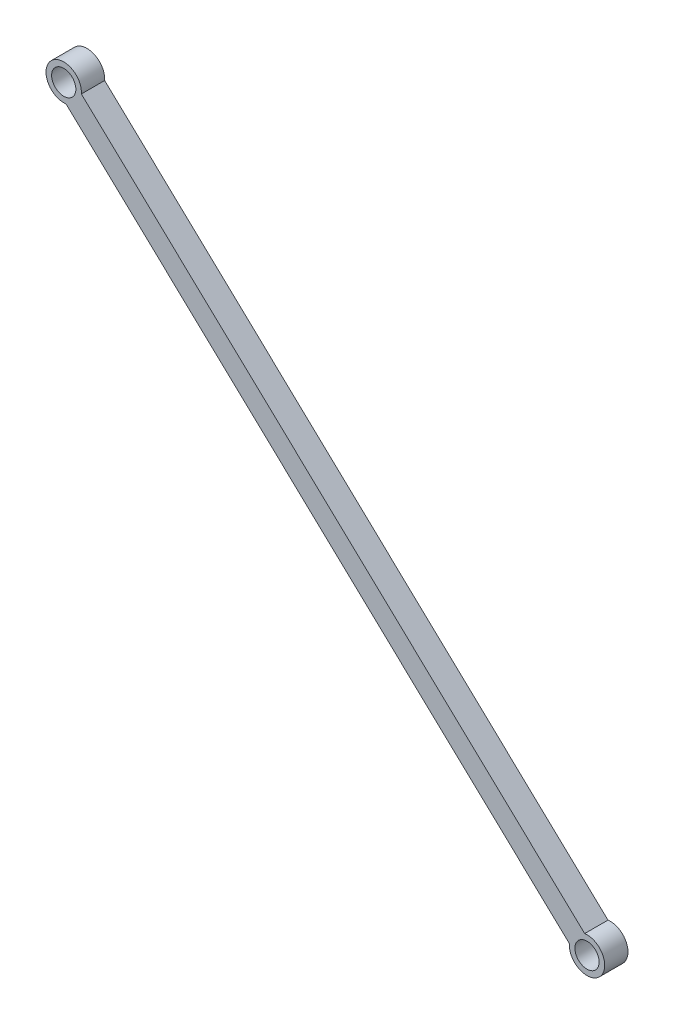
ISO-10303-21;
HEADER;
FILE_DESCRIPTION(('STEP AP214'),'2;1');
FILE_NAME('part.step','',(''),(''),'','','');
FILE_SCHEMA(('AUTOMOTIVE_DESIGN { 1 0 10303 214 1 1 1 1 }'));
ENDSEC;
DATA;
#1=APPLICATION_CONTEXT('core data for automotive mechanical design processes');
#2=APPLICATION_PROTOCOL_DEFINITION('international standard','automotive_design',2000,#1);
#3=PRODUCT_CONTEXT('',#1,'mechanical');
#4=PRODUCT('Part','Part','',(#3));
#5=PRODUCT_RELATED_PRODUCT_CATEGORY('part','',(#4));
#6=PRODUCT_DEFINITION_FORMATION('','',#4);
#7=PRODUCT_DEFINITION_CONTEXT('part definition',#1,'design');
#8=PRODUCT_DEFINITION('design','',#6,#7);
#9=PRODUCT_DEFINITION_SHAPE('','',#8);
#10=(LENGTH_UNIT() NAMED_UNIT(*) SI_UNIT(.MILLI.,.METRE.));
#11=(NAMED_UNIT(*) PLANE_ANGLE_UNIT() SI_UNIT($,.RADIAN.));
#12=(NAMED_UNIT(*) SI_UNIT($,.STERADIAN.) SOLID_ANGLE_UNIT());
#13=UNCERTAINTY_MEASURE_WITH_UNIT(LENGTH_MEASURE(1.E-05),#10,'distance_accuracy_value','');
#14=(GEOMETRIC_REPRESENTATION_CONTEXT(3) GLOBAL_UNCERTAINTY_ASSIGNED_CONTEXT((#13)) GLOBAL_UNIT_ASSIGNED_CONTEXT((#10,
#11,#12)) REPRESENTATION_CONTEXT('',''));
#15=CARTESIAN_POINT('',(0.,0.,0.));
#16=DIRECTION('',(0.,0.,1.));
#17=DIRECTION('',(1.,0.,0.));
#18=AXIS2_PLACEMENT_3D('',#15,#16,#17);
#19=CARTESIAN_POINT('',(-6.15167168991387,-3.239035274185,42.5659871510751));
#20=DIRECTION('',(0.,0.,-1.));
#21=DIRECTION('',(-1.,0.,0.));
#22=AXIS2_PLACEMENT_3D('',#19,#20,#21);
#23=CYLINDRICAL_SURFACE('',#22,0.65);
#24=CARTESIAN_POINT('',(-6.15167168991387,-3.239035274185,0.));
#25=DIRECTION('',(0.,0.,1.));
#26=DIRECTION('',(1.,0.,0.));
#27=AXIS2_PLACEMENT_3D('',#24,#25,#26);
#28=CIRCLE('',#27,0.65);
#29=CARTESIAN_POINT('',(-5.50167168991387,-3.239035274185,0.));
#30=VERTEX_POINT('',#29);
#31=EDGE_CURVE('E102',#30,#30,#28,.T.);
#32=ORIENTED_EDGE('',*,*,#31,.F.);
#33=EDGE_LOOP('',(#32));
#34=FACE_BOUND('',#33,.T.);
#35=CARTESIAN_POINT('',(-6.15167168991387,-3.239035274185,1.24999999999999));
#36=DIRECTION('',(0.,0.,1.));
#37=DIRECTION('',(1.,0.,0.));
#38=AXIS2_PLACEMENT_3D('',#35,#36,#37);
#39=CIRCLE('',#38,0.65);
#40=CARTESIAN_POINT('',(-5.50167168991387,-3.239035274185,1.24999999999999));
#41=VERTEX_POINT('',#40);
#42=EDGE_CURVE('E93',#41,#41,#39,.T.);
#43=ORIENTED_EDGE('',*,*,#42,.T.);
#44=EDGE_LOOP('',(#43));
#45=FACE_BOUND('',#44,.T.);
#46=ADVANCED_FACE('F33',(#34,#45),#23,.F.);
#47=CARTESIAN_POINT('',(-7.09911843373051,-3.16943162750434,42.5659871510751));
#48=DIRECTION('',(0.686686241950203,0.726953922278646,0.));
#49=DIRECTION('',(-0.726953922278646,0.686686241950203,0.));
#50=AXIS2_PLACEMENT_3D('',#47,#48,#49);
#51=PLANE('',#50);
#52=DIRECTION('',(0.726953922278646,-0.686686241950203,0.));
#53=VECTOR('',#52,1.);
#54=CARTESIAN_POINT('',(-7.09911843373051,-3.16943162750434,1.24999999999999));
#55=LINE('',#54,#53);
#56=CARTESIAN_POINT('',(-34.1104784540616,22.3457058989363,1.25000000000001));
#57=VERTEX_POINT('',#56);
#58=CARTESIAN_POINT('',(-7.09911843373051,-3.16943162750434,1.24999999999999));
#59=VERTEX_POINT('',#58);
#60=EDGE_CURVE('E78',#57,#59,#55,.T.);
#61=ORIENTED_EDGE('',*,*,#60,.F.);
#62=DIRECTION('',(0.,0.,-1.));
#63=VECTOR('',#62,1.);
#64=CARTESIAN_POINT('',(-34.1104784540616,22.3457058989363,42.5659871510751));
#65=LINE('',#64,#63);
#66=CARTESIAN_POINT('',(-34.1104784540616,22.3457058989363,0.));
#67=VERTEX_POINT('',#66);
#68=EDGE_CURVE('E49',#57,#67,#65,.T.);
#69=ORIENTED_EDGE('',*,*,#68,.T.);
#70=DIRECTION('',(0.726953922278646,-0.686686241950203,0.));
#71=VECTOR('',#70,1.);
#72=CARTESIAN_POINT('',(-7.09911843373051,-3.16943162750434,0.));
#73=LINE('',#72,#71);
#74=CARTESIAN_POINT('',(-7.09911843373051,-3.16943162750434,0.));
#75=VERTEX_POINT('',#74);
#76=EDGE_CURVE('E81',#67,#75,#73,.T.);
#77=ORIENTED_EDGE('',*,*,#76,.T.);
#78=DIRECTION('',(0.,0.,-1.));
#79=VECTOR('',#78,1.);
#80=CARTESIAN_POINT('',(-7.09911843373051,-3.16943162750434,42.5659871510751));
#81=LINE('',#80,#79);
#82=EDGE_CURVE('E74',#59,#75,#81,.T.);
#83=ORIENTED_EDGE('',*,*,#82,.F.);
#84=EDGE_LOOP('',(#61,#69,#77,#83));
#85=FACE_BOUND('',#84,.T.);
#86=ADVANCED_FACE('F76',(#85),#51,.F.);
#87=CARTESIAN_POINT('',(-34.233901707538,23.2876542523513,42.5659871510751));
#88=DIRECTION('',(0.,0.,-1.));
#89=DIRECTION('',(-1.,0.,0.));
#90=AXIS2_PLACEMENT_3D('',#87,#88,#89);
#91=CYLINDRICAL_SURFACE('',#90,0.949999999999999);
#92=CARTESIAN_POINT('',(-34.233901707538,23.2876542523513,1.24999999999999));
#93=DIRECTION('',(0.,0.,1.));
#94=DIRECTION('',(1.,0.,0.));
#95=AXIS2_PLACEMENT_3D('',#92,#93,#94);
#96=CIRCLE('',#95,0.949999999999999);
#97=CARTESIAN_POINT('',(-33.2864549637213,23.2180506056707,1.25000000000001));
#98=VERTEX_POINT('',#97);
#99=EDGE_CURVE('E92',#98,#57,#96,.T.);
#100=ORIENTED_EDGE('',*,*,#99,.F.);
#101=DIRECTION('',(0.,0.,-1.));
#102=VECTOR('',#101,1.);
#103=CARTESIAN_POINT('',(-33.2864549637213,23.2180506056707,42.5659871510751));
#104=LINE('',#103,#102);
#105=CARTESIAN_POINT('',(-33.2864549637213,23.2180506056707,0.));
#106=VERTEX_POINT('',#105);
#107=EDGE_CURVE('E42',#98,#106,#104,.T.);
#108=ORIENTED_EDGE('',*,*,#107,.T.);
#109=CARTESIAN_POINT('',(-34.233901707538,23.2876542523513,0.));
#110=DIRECTION('',(0.,0.,1.));
#111=DIRECTION('',(1.,0.,0.));
#112=AXIS2_PLACEMENT_3D('',#109,#110,#111);
#113=CIRCLE('',#112,0.949999999999999);
#114=EDGE_CURVE('E110',#106,#67,#113,.T.);
#115=ORIENTED_EDGE('',*,*,#114,.T.);
#116=ORIENTED_EDGE('',*,*,#68,.F.);
#117=EDGE_LOOP('',(#100,#108,#115,#116));
#118=FACE_BOUND('',#117,.T.);
#119=ADVANCED_FACE('F114',(#118),#91,.T.);
#120=CARTESIAN_POINT('',(-6.27509494339025,-2.29708692077002,42.5659871510751));
#121=DIRECTION('',(-0.686686241950203,-0.726953922278645,0.));
#122=DIRECTION('',(0.726953922278645,-0.686686241950203,0.));
#123=AXIS2_PLACEMENT_3D('',#120,#121,#122);
#124=PLANE('',#123);
#125=DIRECTION('',(-0.726953922278645,0.686686241950203,0.));
#126=VECTOR('',#125,1.);
#127=CARTESIAN_POINT('',(-6.27509494339025,-2.29708692077002,1.24999999999999));
#128=LINE('',#127,#126);
#129=CARTESIAN_POINT('',(-6.27509494339025,-2.29708692077002,1.25000000000001));
#130=VERTEX_POINT('',#129);
#131=EDGE_CURVE('E56',#130,#98,#128,.T.);
#132=ORIENTED_EDGE('',*,*,#131,.F.);
#133=DIRECTION('',(0.,0.,-1.));
#134=VECTOR('',#133,1.);
#135=CARTESIAN_POINT('',(-6.27509494339025,-2.29708692077002,42.5659871510751));
#136=LINE('',#135,#134);
#137=CARTESIAN_POINT('',(-6.27509494339025,-2.29708692077002,0.));
#138=VERTEX_POINT('',#137);
#139=EDGE_CURVE('E11',#130,#138,#136,.T.);
#140=ORIENTED_EDGE('',*,*,#139,.T.);
#141=DIRECTION('',(-0.726953922278646,0.686686241950203,0.));
#142=VECTOR('',#141,1.);
#143=CARTESIAN_POINT('',(-6.27509494339025,-2.29708692077002,0.));
#144=LINE('',#143,#142);
#145=EDGE_CURVE('E107',#138,#106,#144,.T.);
#146=ORIENTED_EDGE('',*,*,#145,.T.);
#147=ORIENTED_EDGE('',*,*,#107,.F.);
#148=EDGE_LOOP('',(#132,#140,#146,#147));
#149=FACE_BOUND('',#148,.T.);
#150=ADVANCED_FACE('F117',(#149),#124,.F.);
#151=CARTESIAN_POINT('',(-6.15167168991387,-3.239035274185,42.5659871510751));
#152=DIRECTION('',(0.,0.,-1.));
#153=DIRECTION('',(-1.,0.,0.));
#154=AXIS2_PLACEMENT_3D('',#151,#152,#153);
#155=CYLINDRICAL_SURFACE('',#154,0.949999999999967);
#156=CARTESIAN_POINT('',(-6.15167168991387,-3.239035274185,1.24999999999999));
#157=DIRECTION('',(0.,0.,1.));
#158=DIRECTION('',(1.,0.,0.));
#159=AXIS2_PLACEMENT_3D('',#156,#157,#158);
#160=CIRCLE('',#159,0.949999999999967);
#161=EDGE_CURVE('E87',#59,#130,#160,.T.);
#162=ORIENTED_EDGE('',*,*,#161,.F.);
#163=ORIENTED_EDGE('',*,*,#82,.T.);
#164=CARTESIAN_POINT('',(-6.15167168991387,-3.239035274185,0.));
#165=DIRECTION('',(0.,0.,1.));
#166=DIRECTION('',(1.,0.,0.));
#167=AXIS2_PLACEMENT_3D('',#164,#165,#166);
#168=CIRCLE('',#167,0.949999999999967);
#169=EDGE_CURVE('E105',#75,#138,#168,.T.);
#170=ORIENTED_EDGE('',*,*,#169,.T.);
#171=ORIENTED_EDGE('',*,*,#139,.F.);
#172=EDGE_LOOP('',(#162,#163,#170,#171));
#173=FACE_BOUND('',#172,.T.);
#174=ADVANCED_FACE('F35',(#173),#155,.T.);
#175=CARTESIAN_POINT('',(-6.15167168991387,-3.239035274185,0.));
#176=DIRECTION('',(0.,0.,1.));
#177=DIRECTION('',(1.,0.,0.));
#178=AXIS2_PLACEMENT_3D('',#175,#176,#177);
#179=PLANE('',#178);
#180=ORIENTED_EDGE('',*,*,#169,.F.);
#181=ORIENTED_EDGE('',*,*,#76,.F.);
#182=ORIENTED_EDGE('',*,*,#114,.F.);
#183=ORIENTED_EDGE('',*,*,#145,.F.);
#184=EDGE_LOOP('',(#180,#181,#182,#183));
#185=FACE_BOUND('',#184,.T.);
#186=ORIENTED_EDGE('',*,*,#31,.T.);
#187=EDGE_LOOP('',(#186));
#188=FACE_BOUND('',#187,.T.);
#189=CARTESIAN_POINT('',(-34.233901707538,23.2876542523513,0.));
#190=DIRECTION('',(0.,0.,1.));
#191=DIRECTION('',(1.,0.,0.));
#192=AXIS2_PLACEMENT_3D('',#189,#190,#191);
#193=CIRCLE('',#192,0.649999999999997);
#194=CARTESIAN_POINT('',(-33.583901707538,23.2876542523513,0.));
#195=VERTEX_POINT('',#194);
#196=EDGE_CURVE('E89',#195,#195,#193,.T.);
#197=ORIENTED_EDGE('',*,*,#196,.T.);
#198=EDGE_LOOP('',(#197));
#199=FACE_BOUND('',#198,.T.);
#200=ADVANCED_FACE('F119',(#185,#188,#199),#179,.F.);
#201=CARTESIAN_POINT('',(-34.233901707538,23.2876542523513,42.5659871510751));
#202=DIRECTION('',(0.,0.,-1.));
#203=DIRECTION('',(-1.,0.,0.));
#204=AXIS2_PLACEMENT_3D('',#201,#202,#203);
#205=CYLINDRICAL_SURFACE('',#204,0.649999999999997);
#206=ORIENTED_EDGE('',*,*,#196,.F.);
#207=EDGE_LOOP('',(#206));
#208=FACE_BOUND('',#207,.T.);
#209=CARTESIAN_POINT('',(-34.233901707538,23.2876542523513,1.24999999999999));
#210=DIRECTION('',(0.,0.,1.));
#211=DIRECTION('',(1.,0.,0.));
#212=AXIS2_PLACEMENT_3D('',#209,#210,#211);
#213=CIRCLE('',#212,0.649999999999997);
#214=CARTESIAN_POINT('',(-33.583901707538,23.2876542523513,1.24999999999999));
#215=VERTEX_POINT('',#214);
#216=EDGE_CURVE('E37',#215,#215,#213,.T.);
#217=ORIENTED_EDGE('',*,*,#216,.T.);
#218=EDGE_LOOP('',(#217));
#219=FACE_BOUND('',#218,.T.);
#220=ADVANCED_FACE('F122',(#208,#219),#205,.F.);
#221=CARTESIAN_POINT('',(0.,0.,1.25));
#222=DIRECTION('',(0.,0.,1.));
#223=DIRECTION('',(1.,0.,0.));
#224=AXIS2_PLACEMENT_3D('',#221,#222,#223);
#225=PLANE('',#224);
#226=ORIENTED_EDGE('',*,*,#216,.F.);
#227=EDGE_LOOP('',(#226));
#228=FACE_BOUND('',#227,.T.);
#229=ORIENTED_EDGE('',*,*,#42,.F.);
#230=EDGE_LOOP('',(#229));
#231=FACE_BOUND('',#230,.T.);
#232=ORIENTED_EDGE('',*,*,#60,.T.);
#233=ORIENTED_EDGE('',*,*,#161,.T.);
#234=ORIENTED_EDGE('',*,*,#131,.T.);
#235=ORIENTED_EDGE('',*,*,#99,.T.);
#236=EDGE_LOOP('',(#232,#233,#234,#235));
#237=FACE_BOUND('',#236,.T.);
#238=ADVANCED_FACE('F91',(#228,#231,#237),#225,.T.);
#239=CLOSED_SHELL('',(#46,#86,#119,#150,#174,#200,#220,#238));
#240=MANIFOLD_SOLID_BREP('B2',#239);
#241=ADVANCED_BREP_SHAPE_REPRESENTATION('',(#18,#240),#14);
#242=SHAPE_DEFINITION_REPRESENTATION(#9,#241);
ENDSEC;
END-ISO-10303-21;
